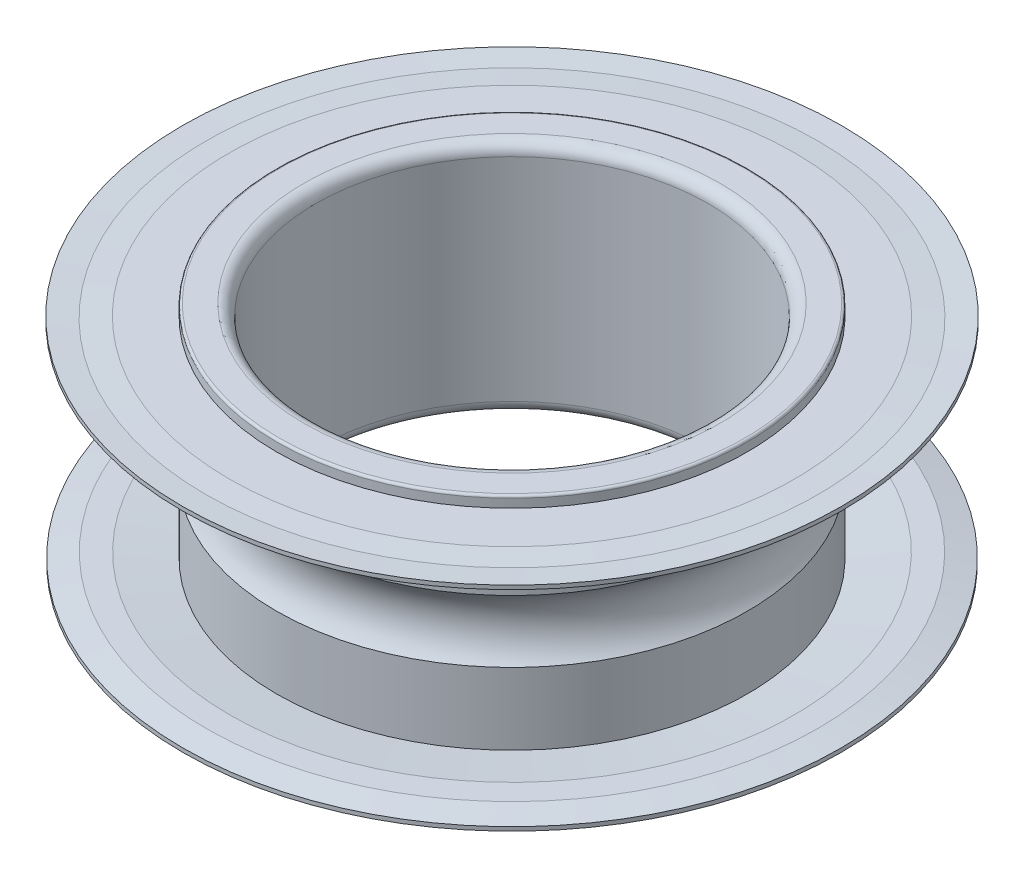
ISO-10303-21;
HEADER;
FILE_DESCRIPTION(('STEP AP214'),'2;1');
FILE_NAME('part.step','',(''),(''),'','','');
FILE_SCHEMA(('AUTOMOTIVE_DESIGN { 1 0 10303 214 1 1 1 1 }'));
ENDSEC;
DATA;
#1=APPLICATION_CONTEXT('core data for automotive mechanical design processes');
#2=APPLICATION_PROTOCOL_DEFINITION('international standard','automotive_design',2000,#1);
#3=PRODUCT_CONTEXT('',#1,'mechanical');
#4=PRODUCT('Part','Part','',(#3));
#5=PRODUCT_RELATED_PRODUCT_CATEGORY('part','',(#4));
#6=PRODUCT_DEFINITION_FORMATION('','',#4);
#7=PRODUCT_DEFINITION_CONTEXT('part definition',#1,'design');
#8=PRODUCT_DEFINITION('design','',#6,#7);
#9=PRODUCT_DEFINITION_SHAPE('','',#8);
#10=(LENGTH_UNIT() NAMED_UNIT(*) SI_UNIT(.MILLI.,.METRE.));
#11=(NAMED_UNIT(*) PLANE_ANGLE_UNIT() SI_UNIT($,.RADIAN.));
#12=(NAMED_UNIT(*) SI_UNIT($,.STERADIAN.) SOLID_ANGLE_UNIT());
#13=UNCERTAINTY_MEASURE_WITH_UNIT(LENGTH_MEASURE(1.E-05),#10,'distance_accuracy_value','');
#14=(GEOMETRIC_REPRESENTATION_CONTEXT(3) GLOBAL_UNCERTAINTY_ASSIGNED_CONTEXT((#13)) GLOBAL_UNIT_ASSIGNED_CONTEXT((#10,
#11,#12)) REPRESENTATION_CONTEXT('',''));
#15=CARTESIAN_POINT('',(0.,0.,0.));
#16=DIRECTION('',(0.,0.,1.));
#17=DIRECTION('',(1.,0.,0.));
#18=AXIS2_PLACEMENT_3D('',#15,#16,#17);
#19=CARTESIAN_POINT('',(0.,9.00000000000001,0.));
#20=DIRECTION('',(0.,-1.,0.));
#21=DIRECTION('',(0.,0.,-1.));
#22=AXIS2_PLACEMENT_3D('',#19,#20,#21);
#23=TOROIDAL_SURFACE('',#22,3.45,0.6);
#24=CARTESIAN_POINT('',(0.,9.39686269665969,0.));
#25=DIRECTION('',(0.,-1.,0.));
#26=DIRECTION('',(0.,0.,-1.));
#27=AXIS2_PLACEMENT_3D('',#24,#25,#26);
#28=CIRCLE('',#27,3.);
#29=CARTESIAN_POINT('',(0.,9.39686269665969,-3.));
#30=VERTEX_POINT('',#29);
#31=EDGE_CURVE('E163',#30,#30,#28,.F.);
#32=ORIENTED_EDGE('',*,*,#31,.F.);
#33=EDGE_LOOP('',(#32));
#34=FACE_BOUND('',#33,.T.);
#35=CARTESIAN_POINT('',(0.,8.60313730334032,0.));
#36=DIRECTION('',(0.,-1.,0.));
#37=DIRECTION('',(0.,0.,-1.));
#38=AXIS2_PLACEMENT_3D('',#35,#36,#37);
#39=CIRCLE('',#38,3.);
#40=CARTESIAN_POINT('',(0.,8.60313730334032,-3.));
#41=VERTEX_POINT('',#40);
#42=EDGE_CURVE('E167',#41,#41,#39,.T.);
#43=ORIENTED_EDGE('',*,*,#42,.F.);
#44=EDGE_LOOP('',(#43));
#45=FACE_BOUND('',#44,.T.);
#46=ADVANCED_FACE('F14',(#34,#45),#23,.F.);
#47=CARTESIAN_POINT('',(0.,0.5,0.));
#48=DIRECTION('',(0.,-1.,0.));
#49=DIRECTION('',(0.,0.,-1.));
#50=AXIS2_PLACEMENT_3D('',#47,#48,#49);
#51=CYLINDRICAL_SURFACE('',#50,3.);
#52=ORIENTED_EDGE('',*,*,#42,.T.);
#53=EDGE_LOOP('',(#52));
#54=FACE_BOUND('',#53,.T.);
#55=CARTESIAN_POINT('',(0.,7.68999999998954,0.));
#56=DIRECTION('',(0.,1.,0.));
#57=DIRECTION('',(0.,0.,1.));
#58=AXIS2_PLACEMENT_3D('',#55,#56,#57);
#59=CIRCLE('',#58,2.9999999999859);
#60=CARTESIAN_POINT('',(0.,7.68999999998954,2.9999999999859));
#61=VERTEX_POINT('',#60);
#62=EDGE_CURVE('E166',#61,#61,#59,.T.);
#63=ORIENTED_EDGE('',*,*,#62,.T.);
#64=EDGE_LOOP('',(#63));
#65=FACE_BOUND('',#64,.T.);
#66=ADVANCED_FACE('F209',(#54,#65),#51,.T.);
#67=CARTESIAN_POINT('',(0.,0.5,0.));
#68=DIRECTION('',(0.,-1.,0.));
#69=DIRECTION('',(0.,0.,-1.));
#70=AXIS2_PLACEMENT_3D('',#67,#68,#69);
#71=CYLINDRICAL_SURFACE('',#70,3.);
#72=CARTESIAN_POINT('',(0.,10.3099999999969,0.));
#73=DIRECTION('',(0.,-1.,0.));
#74=DIRECTION('',(0.,0.,-1.));
#75=AXIS2_PLACEMENT_3D('',#72,#73,#74);
#76=CIRCLE('',#75,2.9999999999859);
#77=CARTESIAN_POINT('',(0.,10.3099999999969,-2.9999999999859));
#78=VERTEX_POINT('',#77);
#79=EDGE_CURVE('E168',#78,#78,#76,.T.);
#80=ORIENTED_EDGE('',*,*,#79,.T.);
#81=EDGE_LOOP('',(#80));
#82=FACE_BOUND('',#81,.T.);
#83=ORIENTED_EDGE('',*,*,#31,.T.);
#84=EDGE_LOOP('',(#83));
#85=FACE_BOUND('',#84,.T.);
#86=ADVANCED_FACE('F205',(#82,#85),#71,.T.);
#87=CARTESIAN_POINT('',(0.,7.75806255806799,0.));
#88=DIRECTION('',(0.,1.,0.));
#89=DIRECTION('',(0.,0.,1.));
#90=AXIS2_PLACEMENT_3D('',#87,#88,#89);
#91=CONICAL_SURFACE('',#90,3.597467562372,1.45736689782533);
#92=CARTESIAN_POINT('',(0.,7.75806255808094,0.));
#93=DIRECTION('',(0.,1.,0.));
#94=DIRECTION('',(0.,0.,1.));
#95=AXIS2_PLACEMENT_3D('',#92,#93,#94);
#96=CIRCLE('',#95,3.59746756248569);
#97=CARTESIAN_POINT('',(0.,7.75806255808094,3.59746756248569));
#98=VERTEX_POINT('',#97);
#99=EDGE_CURVE('E18',#98,#98,#96,.F.);
#100=ORIENTED_EDGE('',*,*,#99,.F.);
#101=EDGE_LOOP('',(#100));
#102=FACE_BOUND('',#101,.T.);
#103=ORIENTED_EDGE('',*,*,#62,.F.);
#104=EDGE_LOOP('',(#103));
#105=FACE_BOUND('',#104,.T.);
#106=ADVANCED_FACE('F201',(#102,#105),#91,.F.);
#107=CARTESIAN_POINT('',(0.,10.2699999999984,0.));
#108=DIRECTION('',(0.,-1.,0.));
#109=DIRECTION('',(0.,0.,-1.));
#110=AXIS2_PLACEMENT_3D('',#107,#108,#109);
#111=CONICAL_SURFACE('',#110,3.59999999994898,1.50422816302379);
#112=CARTESIAN_POINT('',(0.,10.2699999999984,0.));
#113=DIRECTION('',(0.,-1.,0.));
#114=DIRECTION('',(0.,0.,-1.));
#115=AXIS2_PLACEMENT_3D('',#112,#113,#114);
#116=CIRCLE('',#115,3.59999999994898);
#117=CARTESIAN_POINT('',(0.,10.2699999999984,-3.59999999994898));
#118=VERTEX_POINT('',#117);
#119=EDGE_CURVE('E191',#118,#118,#116,.F.);
#120=ORIENTED_EDGE('',*,*,#119,.F.);
#121=EDGE_LOOP('',(#120));
#122=FACE_BOUND('',#121,.T.);
#123=ORIENTED_EDGE('',*,*,#79,.F.);
#124=EDGE_LOOP('',(#123));
#125=FACE_BOUND('',#124,.T.);
#126=ADVANCED_FACE('F204',(#122,#125),#111,.F.);
#127=CARTESIAN_POINT('',(3.89746756245618,7.75806255808206,0.));
#128=DIRECTION('',(0.,1.,0.));
#129=DIRECTION('',(0.,0.,1.));
#130=AXIS2_PLACEMENT_3D('',#127,#128,#129);
#131=PLANE('',#130);
#132=ORIENTED_EDGE('',*,*,#99,.T.);
#133=EDGE_LOOP('',(#132));
#134=FACE_BOUND('',#133,.T.);
#135=CARTESIAN_POINT('',(0.,7.75806255809641,0.));
#136=DIRECTION('',(0.,-1.,0.));
#137=DIRECTION('',(1.,0.,0.));
#138=AXIS2_PLACEMENT_3D('',#135,#136,#137);
#139=CIRCLE('',#138,3.89746756241038);
#140=CARTESIAN_POINT('',(3.89746756241038,7.75806255809641,0.));
#141=VERTEX_POINT('',#140);
#142=EDGE_CURVE('E189',#141,#141,#139,.T.);
#143=ORIENTED_EDGE('',*,*,#142,.F.);
#144=EDGE_LOOP('',(#143));
#145=FACE_BOUND('',#144,.T.);
#146=ADVANCED_FACE('F198',(#134,#145),#131,.T.);
#147=CARTESIAN_POINT('',(3.9,10.27,0.));
#148=DIRECTION('',(0.,-1.,0.));
#149=DIRECTION('',(0.,0.,-1.));
#150=AXIS2_PLACEMENT_3D('',#147,#148,#149);
#151=PLANE('',#150);
#152=ORIENTED_EDGE('',*,*,#119,.T.);
#153=EDGE_LOOP('',(#152));
#154=FACE_BOUND('',#153,.T.);
#155=CARTESIAN_POINT('',(0.,10.2700000000056,0.));
#156=DIRECTION('',(0.,1.,0.));
#157=DIRECTION('',(0.,0.,1.));
#158=AXIS2_PLACEMENT_3D('',#155,#156,#157);
#159=CIRCLE('',#158,3.89999999998736);
#160=CARTESIAN_POINT('',(0.,10.2700000000056,3.89999999998736));
#161=VERTEX_POINT('',#160);
#162=EDGE_CURVE('E160',#161,#161,#159,.T.);
#163=ORIENTED_EDGE('',*,*,#162,.F.);
#164=EDGE_LOOP('',(#163));
#165=FACE_BOUND('',#164,.T.);
#166=ADVANCED_FACE('F360',(#154,#165),#151,.T.);
#167=CARTESIAN_POINT('',(0.,7.68999999999664,0.));
#168=DIRECTION('',(0.,-1.,0.));
#169=DIRECTION('',(1.,0.,0.));
#170=AXIS2_PLACEMENT_3D('',#167,#168,#169);
#171=CONICAL_SURFACE('',#170,4.19237006872208,1.34397129289405);
#172=ORIENTED_EDGE('',*,*,#142,.T.);
#173=EDGE_LOOP('',(#172));
#174=FACE_BOUND('',#173,.T.);
#175=CARTESIAN_POINT('',(0.,7.69000000000001,0.));
#176=DIRECTION('',(0.,-1.,0.));
#177=DIRECTION('',(0.,0.,-1.));
#178=AXIS2_PLACEMENT_3D('',#175,#176,#177);
#179=CIRCLE('',#178,4.19237006869735);
#180=CARTESIAN_POINT('',(0.,7.69000000000001,-4.19237006869735));
#181=VERTEX_POINT('',#180);
#182=EDGE_CURVE('E153',#181,#181,#179,.T.);
#183=ORIENTED_EDGE('',*,*,#182,.F.);
#184=EDGE_LOOP('',(#183));
#185=FACE_BOUND('',#184,.T.);
#186=ADVANCED_FACE('F352',(#174,#185),#171,.T.);
#187=CARTESIAN_POINT('',(0.,10.310000000004,0.));
#188=DIRECTION('',(0.,1.,0.));
#189=DIRECTION('',(0.,0.,1.));
#190=AXIS2_PLACEMENT_3D('',#187,#188,#189);
#191=CONICAL_SURFACE('',#190,4.20000000002574,1.43824479451994);
#192=ORIENTED_EDGE('',*,*,#162,.T.);
#193=EDGE_LOOP('',(#192));
#194=FACE_BOUND('',#193,.T.);
#195=CARTESIAN_POINT('',(0.,10.31,0.));
#196=DIRECTION('',(0.,-1.,0.));
#197=DIRECTION('',(0.,0.,-1.));
#198=AXIS2_PLACEMENT_3D('',#195,#196,#197);
#199=CIRCLE('',#198,4.2);
#200=CARTESIAN_POINT('',(0.,10.31,-4.2));
#201=VERTEX_POINT('',#200);
#202=EDGE_CURVE('E149',#201,#201,#199,.F.);
#203=ORIENTED_EDGE('',*,*,#202,.F.);
#204=EDGE_LOOP('',(#203));
#205=FACE_BOUND('',#204,.T.);
#206=ADVANCED_FACE('F344',(#194,#205),#191,.T.);
#207=CARTESIAN_POINT('',(0.,0.5,0.));
#208=DIRECTION('',(0.,-1.,0.));
#209=DIRECTION('',(0.,0.,-1.));
#210=AXIS2_PLACEMENT_3D('',#207,#208,#209);
#211=CYLINDRICAL_SURFACE('',#210,4.19237006869735);
#212=ORIENTED_EDGE('',*,*,#182,.T.);
#213=EDGE_LOOP('',(#212));
#214=FACE_BOUND('',#213,.T.);
#215=CARTESIAN_POINT('',(0.,7.64000000000919,0.));
#216=DIRECTION('',(0.,-1.,0.));
#217=DIRECTION('',(0.,0.,-1.));
#218=AXIS2_PLACEMENT_3D('',#215,#216,#217);
#219=CIRCLE('',#218,4.19237006872208);
#220=CARTESIAN_POINT('',(0.,7.64000000000919,-4.19237006872208));
#221=VERTEX_POINT('',#220);
#222=EDGE_CURVE('E152',#221,#221,#219,.F.);
#223=ORIENTED_EDGE('',*,*,#222,.T.);
#224=EDGE_LOOP('',(#223));
#225=FACE_BOUND('',#224,.T.);
#226=ADVANCED_FACE('F336',(#214,#225),#211,.T.);
#227=CARTESIAN_POINT('',(0.,0.5,0.));
#228=DIRECTION('',(0.,-1.,0.));
#229=DIRECTION('',(0.,0.,-1.));
#230=AXIS2_PLACEMENT_3D('',#227,#228,#229);
#231=CYLINDRICAL_SURFACE('',#230,4.2);
#232=CARTESIAN_POINT('',(0.,10.3599999999986,0.));
#233=DIRECTION('',(0.,1.,0.));
#234=DIRECTION('',(0.,0.,1.));
#235=AXIS2_PLACEMENT_3D('',#232,#233,#234);
#236=CIRCLE('',#235,4.20000000002574);
#237=CARTESIAN_POINT('',(0.,10.3599999999986,4.20000000002574));
#238=VERTEX_POINT('',#237);
#239=EDGE_CURVE('E148',#238,#238,#236,.F.);
#240=ORIENTED_EDGE('',*,*,#239,.T.);
#241=EDGE_LOOP('',(#240));
#242=FACE_BOUND('',#241,.T.);
#243=ORIENTED_EDGE('',*,*,#202,.T.);
#244=EDGE_LOOP('',(#243));
#245=FACE_BOUND('',#244,.T.);
#246=ADVANCED_FACE('F328',(#242,#245),#231,.T.);
#247=CARTESIAN_POINT('',(0.,7.64000000002341,0.));
#248=DIRECTION('',(0.,-1.,0.));
#249=DIRECTION('',(0.,0.,-1.));
#250=AXIS2_PLACEMENT_3D('',#247,#248,#249);
#251=CONICAL_SURFACE('',#250,4.1923700686084,1.39793571999149);
#252=ORIENTED_EDGE('',*,*,#222,.F.);
#253=EDGE_LOOP('',(#252));
#254=FACE_BOUND('',#253,.T.);
#255=CARTESIAN_POINT('',(0.,7.69171484728304,0.));
#256=DIRECTION('',(0.,1.,0.));
#257=DIRECTION('',(0.,0.,1.));
#258=AXIS2_PLACEMENT_3D('',#255,#256,#257);
#259=CIRCLE('',#258,3.89618503436395);
#260=CARTESIAN_POINT('',(0.,7.69171484728304,3.89618503436395));
#261=VERTEX_POINT('',#260);
#262=EDGE_CURVE('E145',#261,#261,#259,.F.);
#263=ORIENTED_EDGE('',*,*,#262,.F.);
#264=EDGE_LOOP('',(#263));
#265=FACE_BOUND('',#264,.T.);
#266=ADVANCED_FACE('F320',(#254,#265),#251,.F.);
#267=CARTESIAN_POINT('',(0.,10.3599999999986,0.));
#268=DIRECTION('',(0.,1.,0.));
#269=DIRECTION('',(0.,0.,1.));
#270=AXIS2_PLACEMENT_3D('',#267,#268,#269);
#271=CONICAL_SURFACE('',#270,4.1999999999689,1.5042281630065);
#272=ORIENTED_EDGE('',*,*,#239,.F.);
#273=EDGE_LOOP('',(#272));
#274=FACE_BOUND('',#273,.T.);
#275=CARTESIAN_POINT('',(0.,10.3399999999993,0.));
#276=DIRECTION('',(0.,-1.,0.));
#277=DIRECTION('',(0.,0.,-1.));
#278=AXIS2_PLACEMENT_3D('',#275,#276,#277);
#279=CIRCLE('',#278,3.89999999998736);
#280=CARTESIAN_POINT('',(0.,10.3399999999993,-3.89999999998736));
#281=VERTEX_POINT('',#280);
#282=EDGE_CURVE('E136',#281,#281,#279,.F.);
#283=ORIENTED_EDGE('',*,*,#282,.F.);
#284=EDGE_LOOP('',(#283));
#285=FACE_BOUND('',#284,.T.);
#286=ADVANCED_FACE('F312',(#274,#285),#271,.F.);
#287=CARTESIAN_POINT('',(0.,7.69171484726883,0.));
#288=DIRECTION('',(0.,1.,0.));
#289=DIRECTION('',(-1.,0.,0.));
#290=AXIS2_PLACEMENT_3D('',#287,#288,#289);
#291=CONICAL_SURFACE('',#290,3.89618503430711,1.39793571997745);
#292=CARTESIAN_POINT('',(0.,7.6399999999907,0.));
#293=DIRECTION('',(0.,1.,0.));
#294=DIRECTION('',(-1.,0.,0.));
#295=AXIS2_PLACEMENT_3D('',#292,#293,#294);
#296=CIRCLE('',#295,3.59999999994898);
#297=CARTESIAN_POINT('',(-3.59999999994898,7.6399999999907,0.));
#298=VERTEX_POINT('',#297);
#299=EDGE_CURVE('E144',#298,#298,#296,.F.);
#300=ORIENTED_EDGE('',*,*,#299,.F.);
#301=EDGE_LOOP('',(#300));
#302=FACE_BOUND('',#301,.T.);
#303=ORIENTED_EDGE('',*,*,#262,.T.);
#304=EDGE_LOOP('',(#303));
#305=FACE_BOUND('',#304,.T.);
#306=ADVANCED_FACE('F304',(#302,#305),#291,.T.);
#307=CARTESIAN_POINT('',(0.,10.3400000000065,0.));
#308=DIRECTION('',(0.,-1.,0.));
#309=DIRECTION('',(0.,0.,-1.));
#310=AXIS2_PLACEMENT_3D('',#307,#308,#309);
#311=CONICAL_SURFACE('',#310,3.89999999993051,1.5042281630285);
#312=CARTESIAN_POINT('',(0.,10.3599999999948,0.));
#313=DIRECTION('',(0.,-1.,0.));
#314=DIRECTION('',(0.,0.,-1.));
#315=AXIS2_PLACEMENT_3D('',#312,#313,#314);
#316=CIRCLE('',#315,3.60000000006266);
#317=CARTESIAN_POINT('',(0.,10.3599999999948,-3.60000000006266));
#318=VERTEX_POINT('',#317);
#319=EDGE_CURVE('E182',#318,#318,#316,.F.);
#320=ORIENTED_EDGE('',*,*,#319,.F.);
#321=EDGE_LOOP('',(#320));
#322=FACE_BOUND('',#321,.T.);
#323=ORIENTED_EDGE('',*,*,#282,.T.);
#324=EDGE_LOOP('',(#323));
#325=FACE_BOUND('',#324,.T.);
#326=ADVANCED_FACE('F296',(#322,#325),#311,.T.);
#327=CARTESIAN_POINT('',(3.,7.64,0.));
#328=DIRECTION('',(0.,-1.,0.));
#329=DIRECTION('',(0.,0.,-1.));
#330=AXIS2_PLACEMENT_3D('',#327,#328,#329);
#331=PLANE('',#330);
#332=CARTESIAN_POINT('',(0.,7.64000000000001,0.));
#333=DIRECTION('',(0.,-1.,0.));
#334=DIRECTION('',(0.,0.,-1.));
#335=AXIS2_PLACEMENT_3D('',#332,#333,#334);
#336=CIRCLE('',#335,3.);
#337=CARTESIAN_POINT('',(0.,7.64000000000001,-3.));
#338=VERTEX_POINT('',#337);
#339=EDGE_CURVE('E179',#338,#338,#336,.T.);
#340=ORIENTED_EDGE('',*,*,#339,.F.);
#341=EDGE_LOOP('',(#340));
#342=FACE_BOUND('',#341,.T.);
#343=ORIENTED_EDGE('',*,*,#299,.T.);
#344=EDGE_LOOP('',(#343));
#345=FACE_BOUND('',#344,.T.);
#346=ADVANCED_FACE('F288',(#342,#345),#331,.T.);
#347=CARTESIAN_POINT('',(3.,10.36,0.));
#348=DIRECTION('',(0.,1.,0.));
#349=DIRECTION('',(0.,0.,1.));
#350=AXIS2_PLACEMENT_3D('',#347,#348,#349);
#351=PLANE('',#350);
#352=CARTESIAN_POINT('',(0.,10.36,0.));
#353=DIRECTION('',(0.,-1.,0.));
#354=DIRECTION('',(0.,0.,-1.));
#355=AXIS2_PLACEMENT_3D('',#352,#353,#354);
#356=CIRCLE('',#355,3.);
#357=CARTESIAN_POINT('',(0.,10.36,-3.));
#358=VERTEX_POINT('',#357);
#359=EDGE_CURVE('E176',#358,#358,#356,.F.);
#360=ORIENTED_EDGE('',*,*,#359,.F.);
#361=EDGE_LOOP('',(#360));
#362=FACE_BOUND('',#361,.T.);
#363=ORIENTED_EDGE('',*,*,#319,.T.);
#364=EDGE_LOOP('',(#363));
#365=FACE_BOUND('',#364,.T.);
#366=ADVANCED_FACE('F281',(#362,#365),#351,.T.);
#367=CARTESIAN_POINT('',(0.,0.5,0.));
#368=DIRECTION('',(0.,-1.,0.));
#369=DIRECTION('',(0.,0.,-1.));
#370=AXIS2_PLACEMENT_3D('',#367,#368,#369);
#371=CYLINDRICAL_SURFACE('',#370,3.);
#372=ORIENTED_EDGE('',*,*,#339,.T.);
#373=EDGE_LOOP('',(#372));
#374=FACE_BOUND('',#373,.T.);
#375=CARTESIAN_POINT('',(0.,7.53000000000001,0.));
#376=DIRECTION('',(0.,-1.,0.));
#377=DIRECTION('',(0.,0.,-1.));
#378=AXIS2_PLACEMENT_3D('',#375,#376,#377);
#379=CIRCLE('',#378,3.);
#380=CARTESIAN_POINT('',(0.,7.53000000000001,-3.));
#381=VERTEX_POINT('',#380);
#382=EDGE_CURVE('E108',#381,#381,#379,.T.);
#383=ORIENTED_EDGE('',*,*,#382,.F.);
#384=EDGE_LOOP('',(#383));
#385=FACE_BOUND('',#384,.T.);
#386=ADVANCED_FACE('F274',(#374,#385),#371,.T.);
#387=CARTESIAN_POINT('',(0.,0.5,0.));
#388=DIRECTION('',(0.,-1.,0.));
#389=DIRECTION('',(0.,0.,-1.));
#390=AXIS2_PLACEMENT_3D('',#387,#388,#389);
#391=CYLINDRICAL_SURFACE('',#390,3.);
#392=CARTESIAN_POINT('',(0.,10.47,0.));
#393=DIRECTION('',(0.,-1.,0.));
#394=DIRECTION('',(0.,0.,-1.));
#395=AXIS2_PLACEMENT_3D('',#392,#393,#394);
#396=CIRCLE('',#395,3.);
#397=CARTESIAN_POINT('',(0.,10.47,-3.));
#398=VERTEX_POINT('',#397);
#399=EDGE_CURVE('E105',#398,#398,#396,.F.);
#400=ORIENTED_EDGE('',*,*,#399,.F.);
#401=EDGE_LOOP('',(#400));
#402=FACE_BOUND('',#401,.T.);
#403=ORIENTED_EDGE('',*,*,#359,.T.);
#404=EDGE_LOOP('',(#403));
#405=FACE_BOUND('',#404,.T.);
#406=ADVANCED_FACE('F129',(#402,#405),#391,.T.);
#407=CARTESIAN_POINT('',(0.,7.53000000000001,0.));
#408=DIRECTION('',(0.,-1.,0.));
#409=DIRECTION('',(0.,0.,-1.));
#410=AXIS2_PLACEMENT_3D('',#407,#408,#409);
#411=TOROIDAL_SURFACE('',#410,2.97,0.0300000000000003);
#412=ORIENTED_EDGE('',*,*,#382,.T.);
#413=EDGE_LOOP('',(#412));
#414=FACE_BOUND('',#413,.T.);
#415=CARTESIAN_POINT('',(0.,7.50000000000001,0.));
#416=DIRECTION('',(0.,1.,0.));
#417=DIRECTION('',(0.,0.,1.));
#418=AXIS2_PLACEMENT_3D('',#415,#416,#417);
#419=CIRCLE('',#418,2.97);
#420=CARTESIAN_POINT('',(0.,7.50000000000001,2.97));
#421=VERTEX_POINT('',#420);
#422=EDGE_CURVE('E60',#421,#421,#419,.F.);
#423=ORIENTED_EDGE('',*,*,#422,.F.);
#424=EDGE_LOOP('',(#423));
#425=FACE_BOUND('',#424,.T.);
#426=ADVANCED_FACE('F125',(#414,#425),#411,.T.);
#427=CARTESIAN_POINT('',(0.,10.47,0.));
#428=DIRECTION('',(0.,-1.,0.));
#429=DIRECTION('',(0.,0.,-1.));
#430=AXIS2_PLACEMENT_3D('',#427,#428,#429);
#431=TOROIDAL_SURFACE('',#430,2.97,0.0300000000000003);
#432=CARTESIAN_POINT('',(0.,10.5,0.));
#433=DIRECTION('',(0.,-1.,0.));
#434=DIRECTION('',(0.,0.,1.));
#435=AXIS2_PLACEMENT_3D('',#432,#433,#434);
#436=CIRCLE('',#435,2.97);
#437=CARTESIAN_POINT('',(0.,10.5,2.97));
#438=VERTEX_POINT('',#437);
#439=EDGE_CURVE('E113',#438,#438,#436,.F.);
#440=ORIENTED_EDGE('',*,*,#439,.F.);
#441=EDGE_LOOP('',(#440));
#442=FACE_BOUND('',#441,.T.);
#443=ORIENTED_EDGE('',*,*,#399,.T.);
#444=EDGE_LOOP('',(#443));
#445=FACE_BOUND('',#444,.T.);
#446=ADVANCED_FACE('F77',(#442,#445),#431,.T.);
#447=CARTESIAN_POINT('',(2.65,7.50000000000001,0.));
#448=DIRECTION('',(0.,-1.,0.));
#449=DIRECTION('',(0.,0.,-1.));
#450=AXIS2_PLACEMENT_3D('',#447,#448,#449);
#451=PLANE('',#450);
#452=CARTESIAN_POINT('',(0.,7.50000000000001,0.));
#453=DIRECTION('',(0.,-1.,0.));
#454=DIRECTION('',(0.,0.,1.));
#455=AXIS2_PLACEMENT_3D('',#452,#453,#454);
#456=CIRCLE('',#455,2.65);
#457=CARTESIAN_POINT('',(0.,7.50000000000001,2.65));
#458=VERTEX_POINT('',#457);
#459=EDGE_CURVE('E95',#458,#458,#456,.T.);
#460=ORIENTED_EDGE('',*,*,#459,.F.);
#461=EDGE_LOOP('',(#460));
#462=FACE_BOUND('',#461,.T.);
#463=ORIENTED_EDGE('',*,*,#422,.T.);
#464=EDGE_LOOP('',(#463));
#465=FACE_BOUND('',#464,.T.);
#466=ADVANCED_FACE('F67',(#462,#465),#451,.T.);
#467=CARTESIAN_POINT('',(2.65,10.5,0.));
#468=DIRECTION('',(0.,1.,0.));
#469=DIRECTION('',(0.,0.,1.));
#470=AXIS2_PLACEMENT_3D('',#467,#468,#469);
#471=PLANE('',#470);
#472=CARTESIAN_POINT('',(0.,10.5,0.));
#473=DIRECTION('',(0.,1.,0.));
#474=DIRECTION('',(0.,0.,1.));
#475=AXIS2_PLACEMENT_3D('',#472,#473,#474);
#476=CIRCLE('',#475,2.65);
#477=CARTESIAN_POINT('',(0.,10.5,2.65));
#478=VERTEX_POINT('',#477);
#479=EDGE_CURVE('E27',#478,#478,#476,.T.);
#480=ORIENTED_EDGE('',*,*,#479,.F.);
#481=EDGE_LOOP('',(#480));
#482=FACE_BOUND('',#481,.T.);
#483=ORIENTED_EDGE('',*,*,#439,.T.);
#484=EDGE_LOOP('',(#483));
#485=FACE_BOUND('',#484,.T.);
#486=ADVANCED_FACE('F76',(#482,#485),#471,.T.);
#487=CARTESIAN_POINT('',(0.,7.65000000000001,0.));
#488=DIRECTION('',(0.,-1.,0.));
#489=DIRECTION('',(0.,0.,-1.));
#490=AXIS2_PLACEMENT_3D('',#487,#488,#489);
#491=TOROIDAL_SURFACE('',#490,2.65,0.15);
#492=ORIENTED_EDGE('',*,*,#459,.T.);
#493=EDGE_LOOP('',(#492));
#494=FACE_BOUND('',#493,.T.);
#495=CARTESIAN_POINT('',(0.,7.65000000000001,0.));
#496=DIRECTION('',(0.,-1.,0.));
#497=DIRECTION('',(0.,0.,-1.));
#498=AXIS2_PLACEMENT_3D('',#495,#496,#497);
#499=CIRCLE('',#498,2.5);
#500=CARTESIAN_POINT('',(0.,7.65000000000001,-2.5));
#501=VERTEX_POINT('',#500);
#502=EDGE_CURVE('E22',#501,#501,#499,.F.);
#503=ORIENTED_EDGE('',*,*,#502,.T.);
#504=EDGE_LOOP('',(#503));
#505=FACE_BOUND('',#504,.T.);
#506=ADVANCED_FACE('F41',(#494,#505),#491,.T.);
#507=CARTESIAN_POINT('',(0.,10.35,0.));
#508=DIRECTION('',(0.,-1.,0.));
#509=DIRECTION('',(0.,0.,-1.));
#510=AXIS2_PLACEMENT_3D('',#507,#508,#509);
#511=TOROIDAL_SURFACE('',#510,2.65,0.15);
#512=CARTESIAN_POINT('',(0.,10.35,0.));
#513=DIRECTION('',(0.,-1.,0.));
#514=DIRECTION('',(0.,0.,-1.));
#515=AXIS2_PLACEMENT_3D('',#512,#513,#514);
#516=CIRCLE('',#515,2.5);
#517=CARTESIAN_POINT('',(0.,10.35,-2.5));
#518=VERTEX_POINT('',#517);
#519=EDGE_CURVE('E10',#518,#518,#516,.T.);
#520=ORIENTED_EDGE('',*,*,#519,.T.);
#521=EDGE_LOOP('',(#520));
#522=FACE_BOUND('',#521,.T.);
#523=ORIENTED_EDGE('',*,*,#479,.T.);
#524=EDGE_LOOP('',(#523));
#525=FACE_BOUND('',#524,.T.);
#526=ADVANCED_FACE('F35',(#522,#525),#511,.T.);
#527=CARTESIAN_POINT('',(0.,0.5,0.));
#528=DIRECTION('',(0.,-1.,0.));
#529=DIRECTION('',(0.,0.,-1.));
#530=AXIS2_PLACEMENT_3D('',#527,#528,#529);
#531=CYLINDRICAL_SURFACE('',#530,2.5);
#532=ORIENTED_EDGE('',*,*,#502,.F.);
#533=EDGE_LOOP('',(#532));
#534=FACE_BOUND('',#533,.T.);
#535=ORIENTED_EDGE('',*,*,#519,.F.);
#536=EDGE_LOOP('',(#535));
#537=FACE_BOUND('',#536,.T.);
#538=ADVANCED_FACE('F40',(#534,#537),#531,.F.);
#539=CLOSED_SHELL('',(#46,#66,#86,#106,#126,#146,#166,#186,#206,#226,#246,#266,#286,#306,#326,
#346,#366,#386,#406,#426,#446,#466,#486,#506,#526,#538));
#540=MANIFOLD_SOLID_BREP('B1',#539);
#541=ADVANCED_BREP_SHAPE_REPRESENTATION('',(#18,#540),#14);
#542=SHAPE_DEFINITION_REPRESENTATION(#9,#541);
ENDSEC;
END-ISO-10303-21;
